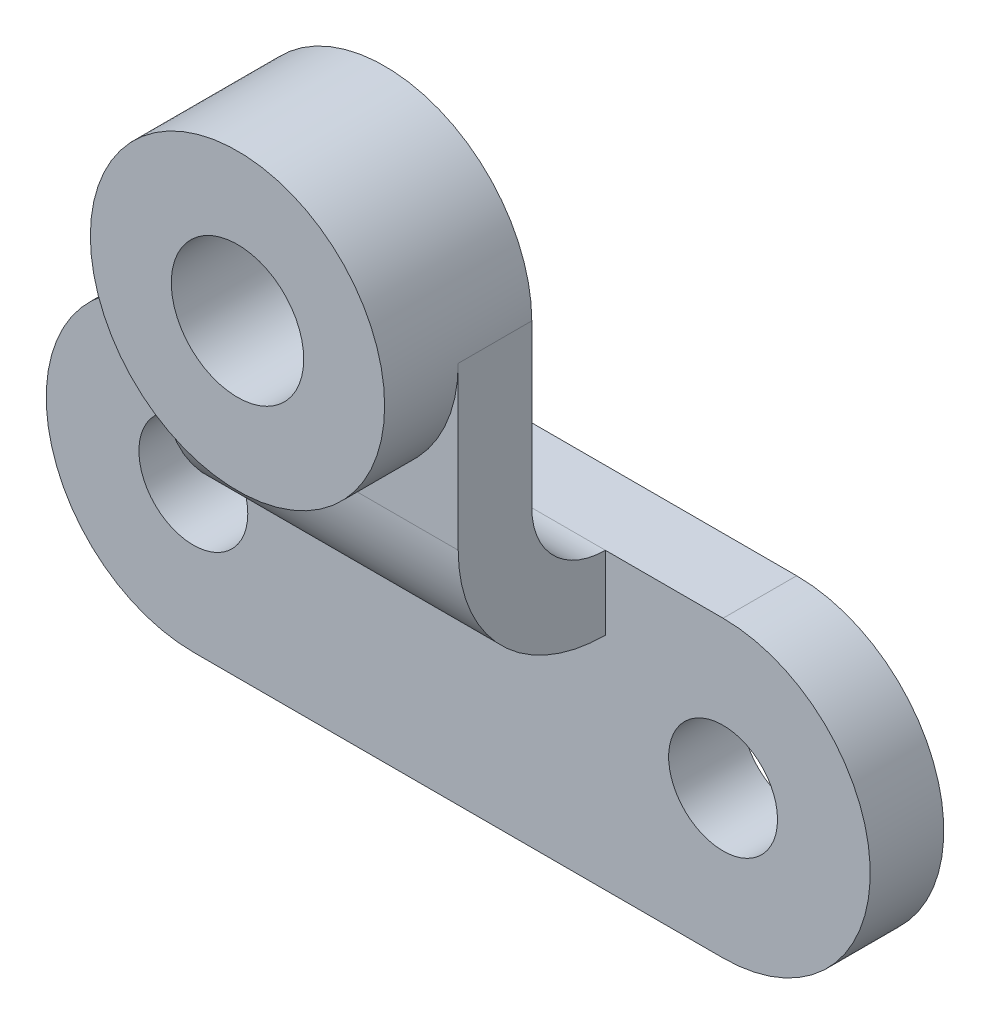
ISO-10303-21;
HEADER;
FILE_DESCRIPTION(('STEP AP214'),'2;1');
FILE_NAME('part.step','',(''),(''),'','','');
FILE_SCHEMA(('AUTOMOTIVE_DESIGN { 1 0 10303 214 1 1 1 1 }'));
ENDSEC;
DATA;
#1=APPLICATION_CONTEXT('core data for automotive mechanical design processes');
#2=APPLICATION_PROTOCOL_DEFINITION('international standard','automotive_design',2000,#1);
#3=PRODUCT_CONTEXT('',#1,'mechanical');
#4=PRODUCT('Part','Part','',(#3));
#5=PRODUCT_RELATED_PRODUCT_CATEGORY('part','',(#4));
#6=PRODUCT_DEFINITION_FORMATION('','',#4);
#7=PRODUCT_DEFINITION_CONTEXT('part definition',#1,'design');
#8=PRODUCT_DEFINITION('design','',#6,#7);
#9=PRODUCT_DEFINITION_SHAPE('','',#8);
#10=(LENGTH_UNIT() NAMED_UNIT(*) SI_UNIT(.MILLI.,.METRE.));
#11=(NAMED_UNIT(*) PLANE_ANGLE_UNIT() SI_UNIT($,.RADIAN.));
#12=(NAMED_UNIT(*) SI_UNIT($,.STERADIAN.) SOLID_ANGLE_UNIT());
#13=UNCERTAINTY_MEASURE_WITH_UNIT(LENGTH_MEASURE(1.E-05),#10,'distance_accuracy_value','');
#14=(GEOMETRIC_REPRESENTATION_CONTEXT(3) GLOBAL_UNCERTAINTY_ASSIGNED_CONTEXT((#13)) GLOBAL_UNIT_ASSIGNED_CONTEXT((#10,
#11,#12)) REPRESENTATION_CONTEXT('',''));
#15=CARTESIAN_POINT('',(0.,0.,0.));
#16=DIRECTION('',(0.,0.,1.));
#17=DIRECTION('',(1.,0.,0.));
#18=AXIS2_PLACEMENT_3D('',#15,#16,#17);
#19=CARTESIAN_POINT('',(0.,0.,25.));
#20=DIRECTION('',(0.,0.,1.));
#21=DIRECTION('',(1.,0.,0.));
#22=AXIS2_PLACEMENT_3D('',#19,#20,#21);
#23=PLANE('',#22);
#24=CARTESIAN_POINT('',(-90.,0.,25.));
#25=DIRECTION('',(0.,0.,1.));
#26=DIRECTION('',(1.,0.,0.));
#27=AXIS2_PLACEMENT_3D('',#24,#25,#26);
#28=CIRCLE('',#27,18.5);
#29=CARTESIAN_POINT('',(-71.5,0.,25.));
#30=VERTEX_POINT('',#29);
#31=EDGE_CURVE('E173',#30,#30,#28,.T.);
#32=ORIENTED_EDGE('',*,*,#31,.F.);
#33=EDGE_LOOP('',(#32));
#34=FACE_BOUND('',#33,.T.);
#35=CARTESIAN_POINT('',(90.,0.,25.));
#36=DIRECTION('',(0.,0.,1.));
#37=DIRECTION('',(1.,0.,0.));
#38=AXIS2_PLACEMENT_3D('',#35,#36,#37);
#39=CIRCLE('',#38,18.5);
#40=CARTESIAN_POINT('',(108.5,0.,25.));
#41=VERTEX_POINT('',#40);
#42=EDGE_CURVE('E176',#41,#41,#39,.F.);
#43=ORIENTED_EDGE('',*,*,#42,.T.);
#44=EDGE_LOOP('',(#43));
#45=FACE_BOUND('',#44,.T.);
#46=DIRECTION('',(1.,0.,0.));
#47=VECTOR('',#46,1.);
#48=CARTESIAN_POINT('',(0.,50.,25.));
#49=LINE('',#48,#47);
#50=CARTESIAN_POINT('',(50.,50.,25.));
#51=VERTEX_POINT('',#50);
#52=CARTESIAN_POINT('',(90.,50.,25.));
#53=VERTEX_POINT('',#52);
#54=EDGE_CURVE('E58',#51,#53,#49,.T.);
#55=ORIENTED_EDGE('',*,*,#54,.F.);
#56=DIRECTION('',(0.,-1.,0.));
#57=VECTOR('',#56,1.);
#58=CARTESIAN_POINT('',(50.,0.,25.));
#59=LINE('',#58,#57);
#60=CARTESIAN_POINT('',(50.,25.,25.));
#61=VERTEX_POINT('',#60);
#62=EDGE_CURVE('E11',#51,#61,#59,.T.);
#63=ORIENTED_EDGE('',*,*,#62,.T.);
#64=DIRECTION('',(-1.,0.,0.));
#65=VECTOR('',#64,1.);
#66=CARTESIAN_POINT('',(50.,25.,24.9999999999998));
#67=LINE('',#66,#65);
#68=CARTESIAN_POINT('',(-50.,25.,24.9999999999998));
#69=VERTEX_POINT('',#68);
#70=EDGE_CURVE('E157',#61,#69,#67,.T.);
#71=ORIENTED_EDGE('',*,*,#70,.T.);
#72=DIRECTION('',(0.,-1.,0.));
#73=VECTOR('',#72,1.);
#74=CARTESIAN_POINT('',(-50.,0.,25.));
#75=LINE('',#74,#73);
#76=CARTESIAN_POINT('',(-50.,50.,25.));
#77=VERTEX_POINT('',#76);
#78=EDGE_CURVE('E48',#77,#69,#75,.T.);
#79=ORIENTED_EDGE('',*,*,#78,.F.);
#80=CARTESIAN_POINT('',(-90.,50.,25.));
#81=VERTEX_POINT('',#80);
#82=EDGE_CURVE('E168',#81,#77,#49,.T.);
#83=ORIENTED_EDGE('',*,*,#82,.F.);
#84=CARTESIAN_POINT('',(-90.,0.,25.));
#85=DIRECTION('',(0.,0.,1.));
#86=DIRECTION('',(1.,0.,0.));
#87=AXIS2_PLACEMENT_3D('',#84,#85,#86);
#88=CIRCLE('',#87,50.);
#89=CARTESIAN_POINT('',(-90.,-50.,25.));
#90=VERTEX_POINT('',#89);
#91=EDGE_CURVE('E171',#81,#90,#88,.T.);
#92=ORIENTED_EDGE('',*,*,#91,.T.);
#93=DIRECTION('',(1.,0.,0.));
#94=VECTOR('',#93,1.);
#95=CARTESIAN_POINT('',(0.,-50.,25.));
#96=LINE('',#95,#94);
#97=CARTESIAN_POINT('',(90.,-50.,25.));
#98=VERTEX_POINT('',#97);
#99=EDGE_CURVE('E162',#90,#98,#96,.T.);
#100=ORIENTED_EDGE('',*,*,#99,.T.);
#101=CARTESIAN_POINT('',(90.,0.,25.));
#102=DIRECTION('',(0.,0.,1.));
#103=DIRECTION('',(1.,0.,0.));
#104=AXIS2_PLACEMENT_3D('',#101,#102,#103);
#105=CIRCLE('',#104,50.);
#106=EDGE_CURVE('E165',#98,#53,#105,.T.);
#107=ORIENTED_EDGE('',*,*,#106,.T.);
#108=EDGE_LOOP('',(#55,#63,#71,#79,#83,#92,#100,#107));
#109=FACE_BOUND('',#108,.T.);
#110=ADVANCED_FACE('F40',(#34,#45,#109),#23,.T.);
#111=CARTESIAN_POINT('',(0.,-50.,25.));
#112=DIRECTION('',(0.,1.,0.));
#113=DIRECTION('',(-1.,0.,0.));
#114=AXIS2_PLACEMENT_3D('',#111,#112,#113);
#115=PLANE('',#114);
#116=DIRECTION('',(1.,0.,0.));
#117=VECTOR('',#116,1.);
#118=CARTESIAN_POINT('',(0.,-50.,0.));
#119=LINE('',#118,#117);
#120=CARTESIAN_POINT('',(-90.,-50.,0.));
#121=VERTEX_POINT('',#120);
#122=CARTESIAN_POINT('',(90.,-50.,0.));
#123=VERTEX_POINT('',#122);
#124=EDGE_CURVE('E161',#121,#123,#119,.T.);
#125=ORIENTED_EDGE('',*,*,#124,.T.);
#126=DIRECTION('',(0.,0.,-1.));
#127=VECTOR('',#126,1.);
#128=CARTESIAN_POINT('',(90.,-50.,25.));
#129=LINE('',#128,#127);
#130=EDGE_CURVE('E201',#98,#123,#129,.T.);
#131=ORIENTED_EDGE('',*,*,#130,.F.);
#132=ORIENTED_EDGE('',*,*,#99,.F.);
#133=DIRECTION('',(0.,0.,-1.));
#134=VECTOR('',#133,1.);
#135=CARTESIAN_POINT('',(-90.,-50.,25.));
#136=LINE('',#135,#134);
#137=EDGE_CURVE('E179',#90,#121,#136,.T.);
#138=ORIENTED_EDGE('',*,*,#137,.T.);
#139=EDGE_LOOP('',(#125,#131,#132,#138));
#140=FACE_BOUND('',#139,.T.);
#141=ADVANCED_FACE('F42',(#140),#115,.F.);
#142=CARTESIAN_POINT('',(90.,0.,25.));
#143=DIRECTION('',(0.,0.,-1.));
#144=DIRECTION('',(-1.,0.,0.));
#145=AXIS2_PLACEMENT_3D('',#142,#143,#144);
#146=CYLINDRICAL_SURFACE('',#145,50.);
#147=CARTESIAN_POINT('',(90.,0.,0.));
#148=DIRECTION('',(0.,0.,1.));
#149=DIRECTION('',(1.,0.,0.));
#150=AXIS2_PLACEMENT_3D('',#147,#148,#149);
#151=CIRCLE('',#150,50.);
#152=CARTESIAN_POINT('',(90.,50.,0.));
#153=VERTEX_POINT('',#152);
#154=EDGE_CURVE('E182',#123,#153,#151,.T.);
#155=ORIENTED_EDGE('',*,*,#154,.T.);
#156=DIRECTION('',(0.,0.,-1.));
#157=VECTOR('',#156,1.);
#158=CARTESIAN_POINT('',(90.,50.,25.));
#159=LINE('',#158,#157);
#160=EDGE_CURVE('E199',#53,#153,#159,.T.);
#161=ORIENTED_EDGE('',*,*,#160,.F.);
#162=ORIENTED_EDGE('',*,*,#106,.F.);
#163=ORIENTED_EDGE('',*,*,#130,.T.);
#164=EDGE_LOOP('',(#155,#161,#162,#163));
#165=FACE_BOUND('',#164,.T.);
#166=ADVANCED_FACE('F254',(#165),#146,.T.);
#167=CARTESIAN_POINT('',(0.,50.,25.));
#168=DIRECTION('',(0.,1.,0.));
#169=DIRECTION('',(-1.,0.,0.));
#170=AXIS2_PLACEMENT_3D('',#167,#168,#169);
#171=PLANE('',#170);
#172=DIRECTION('',(-1.,0.,0.));
#173=VECTOR('',#172,1.);
#174=CARTESIAN_POINT('',(50.,50.,24.9999999999998));
#175=LINE('',#174,#173);
#176=EDGE_CURVE('E154',#51,#77,#175,.T.);
#177=ORIENTED_EDGE('',*,*,#176,.F.);
#178=ORIENTED_EDGE('',*,*,#54,.T.);
#179=ORIENTED_EDGE('',*,*,#160,.T.);
#180=DIRECTION('',(1.,0.,0.));
#181=VECTOR('',#180,1.);
#182=CARTESIAN_POINT('',(0.,50.,0.));
#183=LINE('',#182,#181);
#184=CARTESIAN_POINT('',(-90.,50.,0.));
#185=VERTEX_POINT('',#184);
#186=EDGE_CURVE('E185',#185,#153,#183,.T.);
#187=ORIENTED_EDGE('',*,*,#186,.F.);
#188=DIRECTION('',(0.,0.,-1.));
#189=VECTOR('',#188,1.);
#190=CARTESIAN_POINT('',(-90.,50.,25.));
#191=LINE('',#190,#189);
#192=EDGE_CURVE('E197',#81,#185,#191,.T.);
#193=ORIENTED_EDGE('',*,*,#192,.F.);
#194=ORIENTED_EDGE('',*,*,#82,.T.);
#195=EDGE_LOOP('',(#177,#178,#179,#187,#193,#194));
#196=FACE_BOUND('',#195,.T.);
#197=ADVANCED_FACE('F272',(#196),#171,.T.);
#198=CARTESIAN_POINT('',(-90.,0.,25.));
#199=DIRECTION('',(0.,0.,-1.));
#200=DIRECTION('',(-1.,0.,0.));
#201=AXIS2_PLACEMENT_3D('',#198,#199,#200);
#202=CYLINDRICAL_SURFACE('',#201,18.5);
#203=ORIENTED_EDGE('',*,*,#31,.T.);
#204=EDGE_LOOP('',(#203));
#205=FACE_BOUND('',#204,.T.);
#206=CARTESIAN_POINT('',(-90.,0.,0.));
#207=DIRECTION('',(0.,0.,1.));
#208=DIRECTION('',(1.,0.,0.));
#209=AXIS2_PLACEMENT_3D('',#206,#207,#208);
#210=CIRCLE('',#209,18.5);
#211=CARTESIAN_POINT('',(-71.5,0.,0.));
#212=VERTEX_POINT('',#211);
#213=EDGE_CURVE('E190',#212,#212,#210,.T.);
#214=ORIENTED_EDGE('',*,*,#213,.F.);
#215=EDGE_LOOP('',(#214));
#216=FACE_BOUND('',#215,.T.);
#217=ADVANCED_FACE('F269',(#205,#216),#202,.F.);
#218=CARTESIAN_POINT('',(-90.,0.,25.));
#219=DIRECTION('',(0.,0.,-1.));
#220=DIRECTION('',(-1.,0.,0.));
#221=AXIS2_PLACEMENT_3D('',#218,#219,#220);
#222=CYLINDRICAL_SURFACE('',#221,50.);
#223=CARTESIAN_POINT('',(-90.,0.,0.));
#224=DIRECTION('',(0.,0.,1.));
#225=DIRECTION('',(1.,0.,0.));
#226=AXIS2_PLACEMENT_3D('',#223,#224,#225);
#227=CIRCLE('',#226,50.);
#228=EDGE_CURVE('E188',#185,#121,#227,.T.);
#229=ORIENTED_EDGE('',*,*,#228,.T.);
#230=ORIENTED_EDGE('',*,*,#137,.F.);
#231=ORIENTED_EDGE('',*,*,#91,.F.);
#232=ORIENTED_EDGE('',*,*,#192,.T.);
#233=EDGE_LOOP('',(#229,#230,#231,#232));
#234=FACE_BOUND('',#233,.T.);
#235=ADVANCED_FACE('F267',(#234),#222,.T.);
#236=CARTESIAN_POINT('',(90.,0.,25.));
#237=DIRECTION('',(0.,0.,-1.));
#238=DIRECTION('',(-1.,0.,0.));
#239=AXIS2_PLACEMENT_3D('',#236,#237,#238);
#240=CYLINDRICAL_SURFACE('',#239,18.5);
#241=ORIENTED_EDGE('',*,*,#42,.F.);
#242=EDGE_LOOP('',(#241));
#243=FACE_BOUND('',#242,.T.);
#244=CARTESIAN_POINT('',(90.,0.,0.));
#245=DIRECTION('',(0.,0.,1.));
#246=DIRECTION('',(1.,0.,0.));
#247=AXIS2_PLACEMENT_3D('',#244,#245,#246);
#248=CIRCLE('',#247,18.5);
#249=CARTESIAN_POINT('',(108.5,0.,0.));
#250=VERTEX_POINT('',#249);
#251=EDGE_CURVE('E166',#250,#250,#248,.F.);
#252=ORIENTED_EDGE('',*,*,#251,.T.);
#253=EDGE_LOOP('',(#252));
#254=FACE_BOUND('',#253,.T.);
#255=ADVANCED_FACE('F263',(#243,#254),#240,.F.);
#256=CARTESIAN_POINT('',(0.,0.,0.));
#257=DIRECTION('',(0.,0.,1.));
#258=DIRECTION('',(1.,0.,0.));
#259=AXIS2_PLACEMENT_3D('',#256,#257,#258);
#260=PLANE('',#259);
#261=ORIENTED_EDGE('',*,*,#124,.F.);
#262=ORIENTED_EDGE('',*,*,#228,.F.);
#263=ORIENTED_EDGE('',*,*,#186,.T.);
#264=ORIENTED_EDGE('',*,*,#154,.F.);
#265=EDGE_LOOP('',(#261,#262,#263,#264));
#266=FACE_BOUND('',#265,.T.);
#267=ORIENTED_EDGE('',*,*,#213,.T.);
#268=EDGE_LOOP('',(#267));
#269=FACE_BOUND('',#268,.T.);
#270=ORIENTED_EDGE('',*,*,#251,.F.);
#271=EDGE_LOOP('',(#270));
#272=FACE_BOUND('',#271,.T.);
#273=ADVANCED_FACE('F261',(#266,#269,#272),#260,.F.);
#274=CARTESIAN_POINT('',(50.,130.,75.));
#275=DIRECTION('',(0.,0.,-1.));
#276=DIRECTION('',(-1.,0.,0.));
#277=AXIS2_PLACEMENT_3D('',#274,#275,#276);
#278=PLANE('',#277);
#279=DIRECTION('',(0.,-1.,0.));
#280=VECTOR('',#279,1.);
#281=CARTESIAN_POINT('',(50.,130.,75.));
#282=LINE('',#281,#280);
#283=CARTESIAN_POINT('',(50.,130.,75.));
#284=VERTEX_POINT('',#283);
#285=CARTESIAN_POINT('',(50.,75.,75.));
#286=VERTEX_POINT('',#285);
#287=EDGE_CURVE('E132',#284,#286,#282,.T.);
#288=ORIENTED_EDGE('',*,*,#287,.F.);
#289=CARTESIAN_POINT('',(0.,130.,75.));
#290=DIRECTION('',(0.,0.,-1.));
#291=DIRECTION('',(-1.,0.,0.));
#292=AXIS2_PLACEMENT_3D('',#289,#290,#291);
#293=CIRCLE('',#292,50.);
#294=CARTESIAN_POINT('',(-50.,130.,75.));
#295=VERTEX_POINT('',#294);
#296=EDGE_CURVE('E130',#284,#295,#293,.T.);
#297=ORIENTED_EDGE('',*,*,#296,.T.);
#298=DIRECTION('',(0.,-1.,0.));
#299=VECTOR('',#298,1.);
#300=CARTESIAN_POINT('',(-50.,130.,75.));
#301=LINE('',#300,#299);
#302=CARTESIAN_POINT('',(-50.,75.,75.));
#303=VERTEX_POINT('',#302);
#304=EDGE_CURVE('E114',#295,#303,#301,.T.);
#305=ORIENTED_EDGE('',*,*,#304,.T.);
#306=DIRECTION('',(-1.,0.,0.));
#307=VECTOR('',#306,1.);
#308=CARTESIAN_POINT('',(50.,75.,75.));
#309=LINE('',#308,#307);
#310=EDGE_CURVE('E159',#286,#303,#309,.T.);
#311=ORIENTED_EDGE('',*,*,#310,.F.);
#312=EDGE_LOOP('',(#288,#297,#305,#311));
#313=FACE_BOUND('',#312,.T.);
#314=ADVANCED_FACE('F131',(#313),#278,.F.);
#315=CARTESIAN_POINT('',(50.,75.,25.));
#316=DIRECTION('',(-1.,0.,0.));
#317=DIRECTION('',(0.,0.,1.));
#318=AXIS2_PLACEMENT_3D('',#315,#316,#317);
#319=CYLINDRICAL_SURFACE('',#318,50.);
#320=CARTESIAN_POINT('',(-50.,75.,25.));
#321=DIRECTION('',(1.,0.,0.));
#322=DIRECTION('',(0.,0.,1.));
#323=AXIS2_PLACEMENT_3D('',#320,#321,#322);
#324=CIRCLE('',#323,50.);
#325=EDGE_CURVE('E124',#303,#69,#324,.T.);
#326=ORIENTED_EDGE('',*,*,#325,.T.);
#327=ORIENTED_EDGE('',*,*,#70,.F.);
#328=CARTESIAN_POINT('',(50.,75.,25.));
#329=DIRECTION('',(1.,0.,0.));
#330=DIRECTION('',(0.,0.,1.));
#331=AXIS2_PLACEMENT_3D('',#328,#329,#330);
#332=CIRCLE('',#331,50.);
#333=EDGE_CURVE('E208',#286,#61,#332,.T.);
#334=ORIENTED_EDGE('',*,*,#333,.F.);
#335=ORIENTED_EDGE('',*,*,#310,.T.);
#336=EDGE_LOOP('',(#326,#327,#334,#335));
#337=FACE_BOUND('',#336,.T.);
#338=ADVANCED_FACE('F206',(#337),#319,.T.);
#339=CARTESIAN_POINT('',(50.,75.,25.));
#340=DIRECTION('',(-1.,0.,0.));
#341=DIRECTION('',(0.,0.,1.));
#342=AXIS2_PLACEMENT_3D('',#339,#340,#341);
#343=CYLINDRICAL_SURFACE('',#342,25.);
#344=CARTESIAN_POINT('',(-50.,75.,25.));
#345=DIRECTION('',(-1.,0.,0.));
#346=DIRECTION('',(0.,0.,1.));
#347=AXIS2_PLACEMENT_3D('',#344,#345,#346);
#348=CIRCLE('',#347,25.);
#349=CARTESIAN_POINT('',(-50.,75.0000000000002,50.));
#350=VERTEX_POINT('',#349);
#351=EDGE_CURVE('E146',#77,#350,#348,.T.);
#352=ORIENTED_EDGE('',*,*,#351,.T.);
#353=DIRECTION('',(-1.,0.,0.));
#354=VECTOR('',#353,1.);
#355=CARTESIAN_POINT('',(50.,75.0000000000002,50.));
#356=LINE('',#355,#354);
#357=CARTESIAN_POINT('',(50.,75.0000000000002,50.));
#358=VERTEX_POINT('',#357);
#359=EDGE_CURVE('E151',#358,#350,#356,.T.);
#360=ORIENTED_EDGE('',*,*,#359,.F.);
#361=CARTESIAN_POINT('',(50.,75.,25.));
#362=DIRECTION('',(-1.,0.,0.));
#363=DIRECTION('',(0.,0.,1.));
#364=AXIS2_PLACEMENT_3D('',#361,#362,#363);
#365=CIRCLE('',#364,25.);
#366=EDGE_CURVE('E210',#51,#358,#365,.T.);
#367=ORIENTED_EDGE('',*,*,#366,.F.);
#368=ORIENTED_EDGE('',*,*,#176,.T.);
#369=EDGE_LOOP('',(#352,#360,#367,#368));
#370=FACE_BOUND('',#369,.T.);
#371=ADVANCED_FACE('F293',(#370),#343,.F.);
#372=CARTESIAN_POINT('',(50.,130.,50.));
#373=DIRECTION('',(0.,0.,1.));
#374=DIRECTION('',(1.,0.,0.));
#375=AXIS2_PLACEMENT_3D('',#372,#373,#374);
#376=PLANE('',#375);
#377=CARTESIAN_POINT('',(0.,130.,50.));
#378=DIRECTION('',(0.,0.,1.));
#379=DIRECTION('',(1.,0.,0.));
#380=AXIS2_PLACEMENT_3D('',#377,#378,#379);
#381=CIRCLE('',#380,22.5);
#382=CARTESIAN_POINT('',(22.5,130.,50.));
#383=VERTEX_POINT('',#382);
#384=EDGE_CURVE('E218',#383,#383,#381,.T.);
#385=ORIENTED_EDGE('',*,*,#384,.T.);
#386=EDGE_LOOP('',(#385));
#387=FACE_BOUND('',#386,.T.);
#388=DIRECTION('',(0.,1.,0.));
#389=VECTOR('',#388,1.);
#390=CARTESIAN_POINT('',(-50.,130.,50.));
#391=LINE('',#390,#389);
#392=CARTESIAN_POINT('',(-50.,130.,50.));
#393=VERTEX_POINT('',#392);
#394=EDGE_CURVE('E148',#350,#393,#391,.T.);
#395=ORIENTED_EDGE('',*,*,#394,.T.);
#396=CARTESIAN_POINT('',(0.,130.,50.));
#397=DIRECTION('',(0.,0.,1.));
#398=DIRECTION('',(1.,0.,0.));
#399=AXIS2_PLACEMENT_3D('',#396,#397,#398);
#400=CIRCLE('',#399,50.);
#401=CARTESIAN_POINT('',(50.,130.,50.));
#402=VERTEX_POINT('',#401);
#403=EDGE_CURVE('E136',#402,#393,#400,.T.);
#404=ORIENTED_EDGE('',*,*,#403,.F.);
#405=DIRECTION('',(0.,1.,0.));
#406=VECTOR('',#405,1.);
#407=CARTESIAN_POINT('',(50.,130.,50.));
#408=LINE('',#407,#406);
#409=EDGE_CURVE('E142',#358,#402,#408,.T.);
#410=ORIENTED_EDGE('',*,*,#409,.F.);
#411=ORIENTED_EDGE('',*,*,#359,.T.);
#412=EDGE_LOOP('',(#395,#404,#410,#411));
#413=FACE_BOUND('',#412,.T.);
#414=ADVANCED_FACE('F226',(#387,#413),#376,.F.);
#415=CARTESIAN_POINT('',(50.,75.,25.));
#416=DIRECTION('',(-1.,0.,0.));
#417=DIRECTION('',(0.,0.,1.));
#418=AXIS2_PLACEMENT_3D('',#415,#416,#417);
#419=PLANE('',#418);
#420=ORIENTED_EDGE('',*,*,#62,.F.);
#421=ORIENTED_EDGE('',*,*,#366,.T.);
#422=ORIENTED_EDGE('',*,*,#409,.T.);
#423=DIRECTION('',(0.,0.,1.));
#424=VECTOR('',#423,1.);
#425=CARTESIAN_POINT('',(50.,130.,75.));
#426=LINE('',#425,#424);
#427=EDGE_CURVE('E150',#402,#284,#426,.T.);
#428=ORIENTED_EDGE('',*,*,#427,.T.);
#429=ORIENTED_EDGE('',*,*,#287,.T.);
#430=ORIENTED_EDGE('',*,*,#333,.T.);
#431=EDGE_LOOP('',(#420,#421,#422,#428,#429,#430));
#432=FACE_BOUND('',#431,.T.);
#433=ADVANCED_FACE('F296',(#432),#419,.F.);
#434=CARTESIAN_POINT('',(-50.,75.,25.));
#435=DIRECTION('',(-1.,0.,0.));
#436=DIRECTION('',(0.,0.,1.));
#437=AXIS2_PLACEMENT_3D('',#434,#435,#436);
#438=PLANE('',#437);
#439=ORIENTED_EDGE('',*,*,#351,.F.);
#440=ORIENTED_EDGE('',*,*,#78,.T.);
#441=ORIENTED_EDGE('',*,*,#325,.F.);
#442=ORIENTED_EDGE('',*,*,#304,.F.);
#443=DIRECTION('',(0.,0.,1.));
#444=VECTOR('',#443,1.);
#445=CARTESIAN_POINT('',(-50.,130.,75.));
#446=LINE('',#445,#444);
#447=EDGE_CURVE('E120',#393,#295,#446,.T.);
#448=ORIENTED_EDGE('',*,*,#447,.F.);
#449=ORIENTED_EDGE('',*,*,#394,.F.);
#450=EDGE_LOOP('',(#439,#440,#441,#442,#448,#449));
#451=FACE_BOUND('',#450,.T.);
#452=ADVANCED_FACE('F117',(#451),#438,.T.);
#453=CARTESIAN_POINT('',(0.,130.,50.));
#454=DIRECTION('',(0.,0.,1.));
#455=DIRECTION('',(1.,0.,0.));
#456=AXIS2_PLACEMENT_3D('',#453,#454,#455);
#457=CYLINDRICAL_SURFACE('',#456,22.5);
#458=ORIENTED_EDGE('',*,*,#384,.F.);
#459=EDGE_LOOP('',(#458));
#460=FACE_BOUND('',#459,.T.);
#461=CARTESIAN_POINT('',(0.,130.,100.));
#462=DIRECTION('',(0.,0.,1.));
#463=DIRECTION('',(1.,0.,0.));
#464=AXIS2_PLACEMENT_3D('',#461,#462,#463);
#465=CIRCLE('',#464,22.5);
#466=CARTESIAN_POINT('',(22.5,130.,100.));
#467=VERTEX_POINT('',#466);
#468=EDGE_CURVE('E219',#467,#467,#465,.T.);
#469=ORIENTED_EDGE('',*,*,#468,.T.);
#470=EDGE_LOOP('',(#469));
#471=FACE_BOUND('',#470,.T.);
#472=ADVANCED_FACE('F229',(#460,#471),#457,.F.);
#473=CARTESIAN_POINT('',(0.,130.,50.));
#474=DIRECTION('',(0.,0.,1.));
#475=DIRECTION('',(1.,0.,0.));
#476=AXIS2_PLACEMENT_3D('',#473,#474,#475);
#477=CYLINDRICAL_SURFACE('',#476,50.);
#478=CARTESIAN_POINT('',(0.,130.,100.));
#479=DIRECTION('',(0.,0.,1.));
#480=DIRECTION('',(1.,0.,0.));
#481=AXIS2_PLACEMENT_3D('',#478,#479,#480);
#482=CIRCLE('',#481,50.);
#483=CARTESIAN_POINT('',(50.,130.,100.));
#484=VERTEX_POINT('',#483);
#485=EDGE_CURVE('E215',#484,#484,#482,.T.);
#486=ORIENTED_EDGE('',*,*,#485,.F.);
#487=EDGE_LOOP('',(#486));
#488=FACE_BOUND('',#487,.T.);
#489=ORIENTED_EDGE('',*,*,#427,.F.);
#490=ORIENTED_EDGE('',*,*,#403,.T.);
#491=ORIENTED_EDGE('',*,*,#447,.T.);
#492=ORIENTED_EDGE('',*,*,#296,.F.);
#493=EDGE_LOOP('',(#489,#490,#491,#492));
#494=FACE_BOUND('',#493,.T.);
#495=ADVANCED_FACE('F138',(#488,#494),#477,.T.);
#496=CARTESIAN_POINT('',(0.,0.,100.));
#497=DIRECTION('',(0.,0.,1.));
#498=DIRECTION('',(1.,0.,0.));
#499=AXIS2_PLACEMENT_3D('',#496,#497,#498);
#500=PLANE('',#499);
#501=ORIENTED_EDGE('',*,*,#468,.F.);
#502=EDGE_LOOP('',(#501));
#503=FACE_BOUND('',#502,.T.);
#504=ORIENTED_EDGE('',*,*,#485,.T.);
#505=EDGE_LOOP('',(#504));
#506=FACE_BOUND('',#505,.T.);
#507=ADVANCED_FACE('F235',(#503,#506),#500,.T.);
#508=CLOSED_SHELL('',(#110,#141,#166,#197,#217,#235,#255,#273,#314,#338,#371,#414,#433,#452,
#472,#495,#507));
#509=MANIFOLD_SOLID_BREP('B2',#508);
#510=ADVANCED_BREP_SHAPE_REPRESENTATION('',(#18,#509),#14);
#511=SHAPE_DEFINITION_REPRESENTATION(#9,#510);
ENDSEC;
END-ISO-10303-21;
